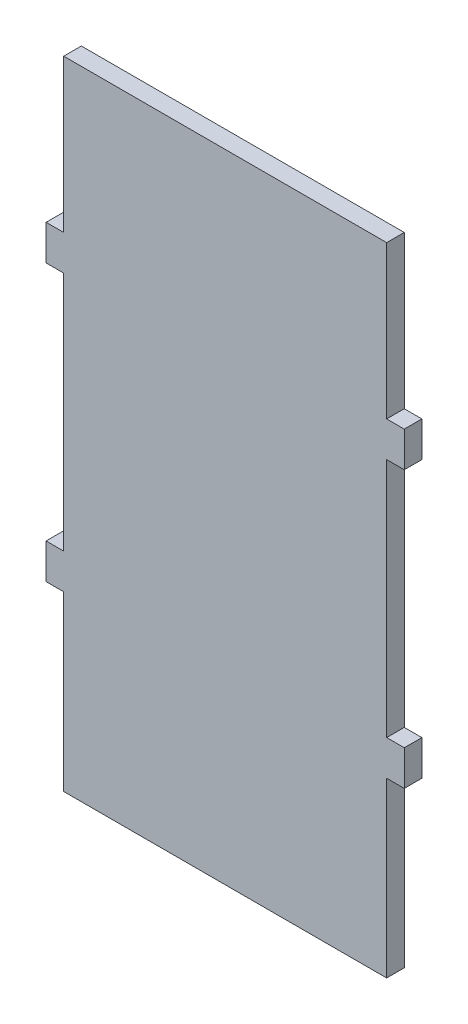
ISO-10303-21;
HEADER;
FILE_DESCRIPTION(('STEP AP214'),'2;1');
FILE_NAME('part.step','',(''),(''),'','','');
FILE_SCHEMA(('AUTOMOTIVE_DESIGN { 1 0 10303 214 1 1 1 1 }'));
ENDSEC;
DATA;
#1=APPLICATION_CONTEXT('core data for automotive mechanical design processes');
#2=APPLICATION_PROTOCOL_DEFINITION('international standard','automotive_design',2000,#1);
#3=PRODUCT_CONTEXT('',#1,'mechanical');
#4=PRODUCT('Part','Part','',(#3));
#5=PRODUCT_RELATED_PRODUCT_CATEGORY('part','',(#4));
#6=PRODUCT_DEFINITION_FORMATION('','',#4);
#7=PRODUCT_DEFINITION_CONTEXT('part definition',#1,'design');
#8=PRODUCT_DEFINITION('design','',#6,#7);
#9=PRODUCT_DEFINITION_SHAPE('','',#8);
#10=(LENGTH_UNIT() NAMED_UNIT(*) SI_UNIT(.MILLI.,.METRE.));
#11=(NAMED_UNIT(*) PLANE_ANGLE_UNIT() SI_UNIT($,.RADIAN.));
#12=(NAMED_UNIT(*) SI_UNIT($,.STERADIAN.) SOLID_ANGLE_UNIT());
#13=UNCERTAINTY_MEASURE_WITH_UNIT(LENGTH_MEASURE(1.E-05),#10,'distance_accuracy_value','');
#14=(GEOMETRIC_REPRESENTATION_CONTEXT(3) GLOBAL_UNCERTAINTY_ASSIGNED_CONTEXT((#13)) GLOBAL_UNIT_ASSIGNED_CONTEXT((#10,
#11,#12)) REPRESENTATION_CONTEXT('',''));
#15=CARTESIAN_POINT('',(0.,0.,0.));
#16=DIRECTION('',(0.,0.,1.));
#17=DIRECTION('',(1.,0.,0.));
#18=AXIS2_PLACEMENT_3D('',#15,#16,#17);
#19=CARTESIAN_POINT('',(0.,-26.,3.));
#20=DIRECTION('',(0.,-1.,0.));
#21=DIRECTION('',(1.,0.,0.));
#22=AXIS2_PLACEMENT_3D('',#19,#20,#21);
#23=PLANE('',#22);
#24=DIRECTION('',(-1.,0.,0.));
#25=VECTOR('',#24,1.);
#26=CARTESIAN_POINT('',(0.,-26.,0.));
#27=LINE('',#26,#25);
#28=CARTESIAN_POINT('',(0.,-26.,0.));
#29=VERTEX_POINT('',#28);
#30=CARTESIAN_POINT('',(-3.,-26.,0.));
#31=VERTEX_POINT('',#30);
#32=EDGE_CURVE('E207',#29,#31,#27,.T.);
#33=ORIENTED_EDGE('',*,*,#32,.T.);
#34=DIRECTION('',(0.,0.,-1.));
#35=VECTOR('',#34,1.);
#36=CARTESIAN_POINT('',(-3.,-26.,3.));
#37=LINE('',#36,#35);
#38=CARTESIAN_POINT('',(-3.,-26.,3.));
#39=VERTEX_POINT('',#38);
#40=EDGE_CURVE('E11',#39,#31,#37,.T.);
#41=ORIENTED_EDGE('',*,*,#40,.F.);
#42=DIRECTION('',(-1.,0.,0.));
#43=VECTOR('',#42,1.);
#44=CARTESIAN_POINT('',(0.,-26.,3.));
#45=LINE('',#44,#43);
#46=CARTESIAN_POINT('',(0.,-26.,3.));
#47=VERTEX_POINT('',#46);
#48=EDGE_CURVE('E245',#47,#39,#45,.T.);
#49=ORIENTED_EDGE('',*,*,#48,.F.);
#50=DIRECTION('',(0.,0.,-1.));
#51=VECTOR('',#50,1.);
#52=CARTESIAN_POINT('',(0.,-26.,3.));
#53=LINE('',#52,#51);
#54=EDGE_CURVE('E203',#47,#29,#53,.T.);
#55=ORIENTED_EDGE('',*,*,#54,.T.);
#56=EDGE_LOOP('',(#33,#41,#49,#55));
#57=FACE_BOUND('',#56,.T.);
#58=ADVANCED_FACE('F39',(#57),#23,.F.);
#59=CARTESIAN_POINT('',(-3.,-26.,3.));
#60=DIRECTION('',(1.,0.,0.));
#61=DIRECTION('',(0.,1.,0.));
#62=AXIS2_PLACEMENT_3D('',#59,#60,#61);
#63=PLANE('',#62);
#64=DIRECTION('',(0.,-1.,0.));
#65=VECTOR('',#64,1.);
#66=CARTESIAN_POINT('',(-3.,-26.,0.));
#67=LINE('',#66,#65);
#68=CARTESIAN_POINT('',(-3.,-32.,0.));
#69=VERTEX_POINT('',#68);
#70=EDGE_CURVE('E210',#31,#69,#67,.T.);
#71=ORIENTED_EDGE('',*,*,#70,.T.);
#72=DIRECTION('',(0.,0.,-1.));
#73=VECTOR('',#72,1.);
#74=CARTESIAN_POINT('',(-3.,-32.,3.));
#75=LINE('',#74,#73);
#76=CARTESIAN_POINT('',(-3.,-32.,3.));
#77=VERTEX_POINT('',#76);
#78=EDGE_CURVE('E47',#77,#69,#75,.T.);
#79=ORIENTED_EDGE('',*,*,#78,.F.);
#80=DIRECTION('',(0.,-1.,0.));
#81=VECTOR('',#80,1.);
#82=CARTESIAN_POINT('',(-3.,-26.,3.));
#83=LINE('',#82,#81);
#84=EDGE_CURVE('E134',#39,#77,#83,.T.);
#85=ORIENTED_EDGE('',*,*,#84,.F.);
#86=ORIENTED_EDGE('',*,*,#40,.T.);
#87=EDGE_LOOP('',(#71,#79,#85,#86));
#88=FACE_BOUND('',#87,.T.);
#89=ADVANCED_FACE('F363',(#88),#63,.F.);
#90=CARTESIAN_POINT('',(0.,-32.,3.));
#91=DIRECTION('',(0.,1.,0.));
#92=DIRECTION('',(0.,0.,1.));
#93=AXIS2_PLACEMENT_3D('',#90,#91,#92);
#94=PLANE('',#93);
#95=DIRECTION('',(1.,0.,0.));
#96=VECTOR('',#95,1.);
#97=CARTESIAN_POINT('',(0.,-32.,0.));
#98=LINE('',#97,#96);
#99=CARTESIAN_POINT('',(0.,-32.,0.));
#100=VERTEX_POINT('',#99);
#101=EDGE_CURVE('E212',#69,#100,#98,.T.);
#102=ORIENTED_EDGE('',*,*,#101,.T.);
#103=DIRECTION('',(0.,0.,-1.));
#104=VECTOR('',#103,1.);
#105=CARTESIAN_POINT('',(0.,-32.,3.));
#106=LINE('',#105,#104);
#107=CARTESIAN_POINT('',(0.,-32.,3.));
#108=VERTEX_POINT('',#107);
#109=EDGE_CURVE('E288',#108,#100,#106,.T.);
#110=ORIENTED_EDGE('',*,*,#109,.F.);
#111=DIRECTION('',(1.,0.,0.));
#112=VECTOR('',#111,1.);
#113=CARTESIAN_POINT('',(0.,-32.,3.));
#114=LINE('',#113,#112);
#115=EDGE_CURVE('E296',#77,#108,#114,.T.);
#116=ORIENTED_EDGE('',*,*,#115,.F.);
#117=ORIENTED_EDGE('',*,*,#78,.T.);
#118=EDGE_LOOP('',(#102,#110,#116,#117));
#119=FACE_BOUND('',#118,.T.);
#120=ADVANCED_FACE('F294',(#119),#94,.F.);
#121=CARTESIAN_POINT('',(0.,-32.,3.));
#122=DIRECTION('',(1.,0.,0.));
#123=DIRECTION('',(0.,1.,0.));
#124=AXIS2_PLACEMENT_3D('',#121,#122,#123);
#125=PLANE('',#124);
#126=DIRECTION('',(0.,-1.,0.));
#127=VECTOR('',#126,1.);
#128=CARTESIAN_POINT('',(0.,-32.,0.));
#129=LINE('',#128,#127);
#130=CARTESIAN_POINT('',(0.,-73.,0.));
#131=VERTEX_POINT('',#130);
#132=EDGE_CURVE('E214',#100,#131,#129,.T.);
#133=ORIENTED_EDGE('',*,*,#132,.T.);
#134=DIRECTION('',(0.,0.,-1.));
#135=VECTOR('',#134,1.);
#136=CARTESIAN_POINT('',(0.,-73.,3.));
#137=LINE('',#136,#135);
#138=CARTESIAN_POINT('',(0.,-73.,3.));
#139=VERTEX_POINT('',#138);
#140=EDGE_CURVE('E285',#139,#131,#137,.T.);
#141=ORIENTED_EDGE('',*,*,#140,.F.);
#142=DIRECTION('',(0.,-1.,0.));
#143=VECTOR('',#142,1.);
#144=CARTESIAN_POINT('',(0.,-32.,3.));
#145=LINE('',#144,#143);
#146=EDGE_CURVE('E314',#108,#139,#145,.T.);
#147=ORIENTED_EDGE('',*,*,#146,.F.);
#148=ORIENTED_EDGE('',*,*,#109,.T.);
#149=EDGE_LOOP('',(#133,#141,#147,#148));
#150=FACE_BOUND('',#149,.T.);
#151=ADVANCED_FACE('F305',(#150),#125,.F.);
#152=CARTESIAN_POINT('',(0.,-73.,3.));
#153=DIRECTION('',(0.,-1.,0.));
#154=DIRECTION('',(0.,0.,-1.));
#155=AXIS2_PLACEMENT_3D('',#152,#153,#154);
#156=PLANE('',#155);
#157=DIRECTION('',(-1.,0.,0.));
#158=VECTOR('',#157,1.);
#159=CARTESIAN_POINT('',(0.,-73.,0.));
#160=LINE('',#159,#158);
#161=CARTESIAN_POINT('',(-3.,-73.,0.));
#162=VERTEX_POINT('',#161);
#163=EDGE_CURVE('E216',#131,#162,#160,.T.);
#164=ORIENTED_EDGE('',*,*,#163,.T.);
#165=DIRECTION('',(0.,0.,-1.));
#166=VECTOR('',#165,1.);
#167=CARTESIAN_POINT('',(-3.,-73.,3.));
#168=LINE('',#167,#166);
#169=CARTESIAN_POINT('',(-3.,-73.,3.));
#170=VERTEX_POINT('',#169);
#171=EDGE_CURVE('E282',#170,#162,#168,.T.);
#172=ORIENTED_EDGE('',*,*,#171,.F.);
#173=DIRECTION('',(-1.,0.,0.));
#174=VECTOR('',#173,1.);
#175=CARTESIAN_POINT('',(0.,-73.,3.));
#176=LINE('',#175,#174);
#177=EDGE_CURVE('E311',#139,#170,#176,.T.);
#178=ORIENTED_EDGE('',*,*,#177,.F.);
#179=ORIENTED_EDGE('',*,*,#140,.T.);
#180=EDGE_LOOP('',(#164,#172,#178,#179));
#181=FACE_BOUND('',#180,.T.);
#182=ADVANCED_FACE('F309',(#181),#156,.F.);
#183=CARTESIAN_POINT('',(-3.,-73.,3.));
#184=DIRECTION('',(1.,0.,0.));
#185=DIRECTION('',(0.,1.,0.));
#186=AXIS2_PLACEMENT_3D('',#183,#184,#185);
#187=PLANE('',#186);
#188=DIRECTION('',(0.,-1.,0.));
#189=VECTOR('',#188,1.);
#190=CARTESIAN_POINT('',(-3.,-73.,0.));
#191=LINE('',#190,#189);
#192=CARTESIAN_POINT('',(-3.,-79.,0.));
#193=VERTEX_POINT('',#192);
#194=EDGE_CURVE('E218',#162,#193,#191,.T.);
#195=ORIENTED_EDGE('',*,*,#194,.T.);
#196=DIRECTION('',(0.,0.,-1.));
#197=VECTOR('',#196,1.);
#198=CARTESIAN_POINT('',(-3.,-79.,3.));
#199=LINE('',#198,#197);
#200=CARTESIAN_POINT('',(-3.,-79.,3.));
#201=VERTEX_POINT('',#200);
#202=EDGE_CURVE('E279',#201,#193,#199,.T.);
#203=ORIENTED_EDGE('',*,*,#202,.F.);
#204=DIRECTION('',(0.,-1.,0.));
#205=VECTOR('',#204,1.);
#206=CARTESIAN_POINT('',(-3.,-73.,3.));
#207=LINE('',#206,#205);
#208=EDGE_CURVE('E313',#170,#201,#207,.T.);
#209=ORIENTED_EDGE('',*,*,#208,.F.);
#210=ORIENTED_EDGE('',*,*,#171,.T.);
#211=EDGE_LOOP('',(#195,#203,#209,#210));
#212=FACE_BOUND('',#211,.T.);
#213=ADVANCED_FACE('F376',(#212),#187,.F.);
#214=CARTESIAN_POINT('',(0.,-79.,3.));
#215=DIRECTION('',(0.,1.,0.));
#216=DIRECTION('',(0.,0.,1.));
#217=AXIS2_PLACEMENT_3D('',#214,#215,#216);
#218=PLANE('',#217);
#219=DIRECTION('',(1.,0.,0.));
#220=VECTOR('',#219,1.);
#221=CARTESIAN_POINT('',(0.,-79.,0.));
#222=LINE('',#221,#220);
#223=CARTESIAN_POINT('',(0.,-79.,0.));
#224=VERTEX_POINT('',#223);
#225=EDGE_CURVE('E220',#193,#224,#222,.T.);
#226=ORIENTED_EDGE('',*,*,#225,.T.);
#227=DIRECTION('',(0.,0.,-1.));
#228=VECTOR('',#227,1.);
#229=CARTESIAN_POINT('',(0.,-79.,3.));
#230=LINE('',#229,#228);
#231=CARTESIAN_POINT('',(0.,-79.,3.));
#232=VERTEX_POINT('',#231);
#233=EDGE_CURVE('E276',#232,#224,#230,.T.);
#234=ORIENTED_EDGE('',*,*,#233,.F.);
#235=DIRECTION('',(1.,0.,0.));
#236=VECTOR('',#235,1.);
#237=CARTESIAN_POINT('',(0.,-79.,3.));
#238=LINE('',#237,#236);
#239=EDGE_CURVE('E316',#201,#232,#238,.T.);
#240=ORIENTED_EDGE('',*,*,#239,.F.);
#241=ORIENTED_EDGE('',*,*,#202,.T.);
#242=EDGE_LOOP('',(#226,#234,#240,#241));
#243=FACE_BOUND('',#242,.T.);
#244=ADVANCED_FACE('F379',(#243),#218,.F.);
#245=CARTESIAN_POINT('',(0.,-79.,3.));
#246=DIRECTION('',(1.,0.,0.));
#247=DIRECTION('',(0.,1.,0.));
#248=AXIS2_PLACEMENT_3D('',#245,#246,#247);
#249=PLANE('',#248);
#250=DIRECTION('',(0.,-1.,0.));
#251=VECTOR('',#250,1.);
#252=CARTESIAN_POINT('',(0.,-79.,0.));
#253=LINE('',#252,#251);
#254=CARTESIAN_POINT('',(0.,-108.46,0.));
#255=VERTEX_POINT('',#254);
#256=EDGE_CURVE('E222',#224,#255,#253,.T.);
#257=ORIENTED_EDGE('',*,*,#256,.T.);
#258=DIRECTION('',(0.,0.,-1.));
#259=VECTOR('',#258,1.);
#260=CARTESIAN_POINT('',(0.,-108.46,3.));
#261=LINE('',#260,#259);
#262=CARTESIAN_POINT('',(0.,-108.46,3.));
#263=VERTEX_POINT('',#262);
#264=EDGE_CURVE('E273',#263,#255,#261,.T.);
#265=ORIENTED_EDGE('',*,*,#264,.F.);
#266=DIRECTION('',(0.,-1.,0.));
#267=VECTOR('',#266,1.);
#268=CARTESIAN_POINT('',(0.,-79.,3.));
#269=LINE('',#268,#267);
#270=EDGE_CURVE('E322',#232,#263,#269,.T.);
#271=ORIENTED_EDGE('',*,*,#270,.F.);
#272=ORIENTED_EDGE('',*,*,#233,.T.);
#273=EDGE_LOOP('',(#257,#265,#271,#272));
#274=FACE_BOUND('',#273,.T.);
#275=ADVANCED_FACE('F383',(#274),#249,.F.);
#276=CARTESIAN_POINT('',(0.,-108.46,3.));
#277=DIRECTION('',(0.,1.,0.));
#278=DIRECTION('',(0.,0.,1.));
#279=AXIS2_PLACEMENT_3D('',#276,#277,#278);
#280=PLANE('',#279);
#281=DIRECTION('',(1.,0.,0.));
#282=VECTOR('',#281,1.);
#283=CARTESIAN_POINT('',(0.,-108.46,0.));
#284=LINE('',#283,#282);
#285=CARTESIAN_POINT('',(55.,-108.46,0.));
#286=VERTEX_POINT('',#285);
#287=EDGE_CURVE('E224',#255,#286,#284,.T.);
#288=ORIENTED_EDGE('',*,*,#287,.T.);
#289=DIRECTION('',(0.,0.,-1.));
#290=VECTOR('',#289,1.);
#291=CARTESIAN_POINT('',(55.,-108.46,3.));
#292=LINE('',#291,#290);
#293=CARTESIAN_POINT('',(55.,-108.46,3.));
#294=VERTEX_POINT('',#293);
#295=EDGE_CURVE('E270',#294,#286,#292,.T.);
#296=ORIENTED_EDGE('',*,*,#295,.F.);
#297=DIRECTION('',(1.,0.,0.));
#298=VECTOR('',#297,1.);
#299=CARTESIAN_POINT('',(0.,-108.46,3.));
#300=LINE('',#299,#298);
#301=EDGE_CURVE('E324',#263,#294,#300,.T.);
#302=ORIENTED_EDGE('',*,*,#301,.F.);
#303=ORIENTED_EDGE('',*,*,#264,.T.);
#304=EDGE_LOOP('',(#288,#296,#302,#303));
#305=FACE_BOUND('',#304,.T.);
#306=ADVANCED_FACE('F387',(#305),#280,.F.);
#307=CARTESIAN_POINT('',(55.,-79.,3.));
#308=DIRECTION('',(-1.,0.,0.));
#309=DIRECTION('',(0.,-1.,0.));
#310=AXIS2_PLACEMENT_3D('',#307,#308,#309);
#311=PLANE('',#310);
#312=DIRECTION('',(0.,1.,0.));
#313=VECTOR('',#312,1.);
#314=CARTESIAN_POINT('',(55.,-79.,0.));
#315=LINE('',#314,#313);
#316=CARTESIAN_POINT('',(55.,-79.,0.));
#317=VERTEX_POINT('',#316);
#318=EDGE_CURVE('E226',#286,#317,#315,.T.);
#319=ORIENTED_EDGE('',*,*,#318,.T.);
#320=DIRECTION('',(0.,0.,-1.));
#321=VECTOR('',#320,1.);
#322=CARTESIAN_POINT('',(55.,-79.,3.));
#323=LINE('',#322,#321);
#324=CARTESIAN_POINT('',(55.,-79.,3.));
#325=VERTEX_POINT('',#324);
#326=EDGE_CURVE('E267',#325,#317,#323,.T.);
#327=ORIENTED_EDGE('',*,*,#326,.F.);
#328=DIRECTION('',(0.,1.,0.));
#329=VECTOR('',#328,1.);
#330=CARTESIAN_POINT('',(55.,-79.,3.));
#331=LINE('',#330,#329);
#332=EDGE_CURVE('E326',#294,#325,#331,.T.);
#333=ORIENTED_EDGE('',*,*,#332,.F.);
#334=ORIENTED_EDGE('',*,*,#295,.T.);
#335=EDGE_LOOP('',(#319,#327,#333,#334));
#336=FACE_BOUND('',#335,.T.);
#337=ADVANCED_FACE('F391',(#336),#311,.F.);
#338=CARTESIAN_POINT('',(55.,-79.,3.));
#339=DIRECTION('',(0.,1.,0.));
#340=DIRECTION('',(0.,0.,1.));
#341=AXIS2_PLACEMENT_3D('',#338,#339,#340);
#342=PLANE('',#341);
#343=DIRECTION('',(1.,0.,0.));
#344=VECTOR('',#343,1.);
#345=CARTESIAN_POINT('',(55.,-79.,0.));
#346=LINE('',#345,#344);
#347=CARTESIAN_POINT('',(58.,-79.,0.));
#348=VERTEX_POINT('',#347);
#349=EDGE_CURVE('E228',#317,#348,#346,.T.);
#350=ORIENTED_EDGE('',*,*,#349,.T.);
#351=DIRECTION('',(0.,0.,-1.));
#352=VECTOR('',#351,1.);
#353=CARTESIAN_POINT('',(58.,-79.,3.));
#354=LINE('',#353,#352);
#355=CARTESIAN_POINT('',(58.,-79.,3.));
#356=VERTEX_POINT('',#355);
#357=EDGE_CURVE('E264',#356,#348,#354,.T.);
#358=ORIENTED_EDGE('',*,*,#357,.F.);
#359=DIRECTION('',(1.,0.,0.));
#360=VECTOR('',#359,1.);
#361=CARTESIAN_POINT('',(55.,-79.,3.));
#362=LINE('',#361,#360);
#363=EDGE_CURVE('E328',#325,#356,#362,.T.);
#364=ORIENTED_EDGE('',*,*,#363,.F.);
#365=ORIENTED_EDGE('',*,*,#326,.T.);
#366=EDGE_LOOP('',(#350,#358,#364,#365));
#367=FACE_BOUND('',#366,.T.);
#368=ADVANCED_FACE('F395',(#367),#342,.F.);
#369=CARTESIAN_POINT('',(58.,-73.,3.));
#370=DIRECTION('',(-1.,0.,0.));
#371=DIRECTION('',(0.,-1.,0.));
#372=AXIS2_PLACEMENT_3D('',#369,#370,#371);
#373=PLANE('',#372);
#374=DIRECTION('',(0.,1.,0.));
#375=VECTOR('',#374,1.);
#376=CARTESIAN_POINT('',(58.,-73.,0.));
#377=LINE('',#376,#375);
#378=CARTESIAN_POINT('',(58.,-73.,0.));
#379=VERTEX_POINT('',#378);
#380=EDGE_CURVE('E230',#348,#379,#377,.T.);
#381=ORIENTED_EDGE('',*,*,#380,.T.);
#382=DIRECTION('',(0.,0.,-1.));
#383=VECTOR('',#382,1.);
#384=CARTESIAN_POINT('',(58.,-73.,3.));
#385=LINE('',#384,#383);
#386=CARTESIAN_POINT('',(58.,-73.,3.));
#387=VERTEX_POINT('',#386);
#388=EDGE_CURVE('E261',#387,#379,#385,.T.);
#389=ORIENTED_EDGE('',*,*,#388,.F.);
#390=DIRECTION('',(0.,1.,0.));
#391=VECTOR('',#390,1.);
#392=CARTESIAN_POINT('',(58.,-73.,3.));
#393=LINE('',#392,#391);
#394=EDGE_CURVE('E330',#356,#387,#393,.T.);
#395=ORIENTED_EDGE('',*,*,#394,.F.);
#396=ORIENTED_EDGE('',*,*,#357,.T.);
#397=EDGE_LOOP('',(#381,#389,#395,#396));
#398=FACE_BOUND('',#397,.T.);
#399=ADVANCED_FACE('F399',(#398),#373,.F.);
#400=CARTESIAN_POINT('',(55.,-73.,3.));
#401=DIRECTION('',(0.,-1.,0.));
#402=DIRECTION('',(1.,0.,0.));
#403=AXIS2_PLACEMENT_3D('',#400,#401,#402);
#404=PLANE('',#403);
#405=DIRECTION('',(-1.,0.,0.));
#406=VECTOR('',#405,1.);
#407=CARTESIAN_POINT('',(55.,-73.,0.));
#408=LINE('',#407,#406);
#409=CARTESIAN_POINT('',(55.,-73.,0.));
#410=VERTEX_POINT('',#409);
#411=EDGE_CURVE('E232',#379,#410,#408,.T.);
#412=ORIENTED_EDGE('',*,*,#411,.T.);
#413=DIRECTION('',(0.,0.,-1.));
#414=VECTOR('',#413,1.);
#415=CARTESIAN_POINT('',(55.,-73.,3.));
#416=LINE('',#415,#414);
#417=CARTESIAN_POINT('',(55.,-73.,3.));
#418=VERTEX_POINT('',#417);
#419=EDGE_CURVE('E258',#418,#410,#416,.T.);
#420=ORIENTED_EDGE('',*,*,#419,.F.);
#421=DIRECTION('',(-1.,0.,0.));
#422=VECTOR('',#421,1.);
#423=CARTESIAN_POINT('',(55.,-73.,3.));
#424=LINE('',#423,#422);
#425=EDGE_CURVE('E332',#387,#418,#424,.T.);
#426=ORIENTED_EDGE('',*,*,#425,.F.);
#427=ORIENTED_EDGE('',*,*,#388,.T.);
#428=EDGE_LOOP('',(#412,#420,#426,#427));
#429=FACE_BOUND('',#428,.T.);
#430=ADVANCED_FACE('F403',(#429),#404,.F.);
#431=CARTESIAN_POINT('',(55.,-32.,3.));
#432=DIRECTION('',(-1.,0.,0.));
#433=DIRECTION('',(0.,-1.,0.));
#434=AXIS2_PLACEMENT_3D('',#431,#432,#433);
#435=PLANE('',#434);
#436=DIRECTION('',(0.,1.,0.));
#437=VECTOR('',#436,1.);
#438=CARTESIAN_POINT('',(55.,-32.,0.));
#439=LINE('',#438,#437);
#440=CARTESIAN_POINT('',(55.,-32.,0.));
#441=VERTEX_POINT('',#440);
#442=EDGE_CURVE('E234',#410,#441,#439,.T.);
#443=ORIENTED_EDGE('',*,*,#442,.T.);
#444=DIRECTION('',(0.,0.,-1.));
#445=VECTOR('',#444,1.);
#446=CARTESIAN_POINT('',(55.,-32.,3.));
#447=LINE('',#446,#445);
#448=CARTESIAN_POINT('',(55.,-32.,3.));
#449=VERTEX_POINT('',#448);
#450=EDGE_CURVE('E255',#449,#441,#447,.T.);
#451=ORIENTED_EDGE('',*,*,#450,.F.);
#452=DIRECTION('',(0.,1.,0.));
#453=VECTOR('',#452,1.);
#454=CARTESIAN_POINT('',(55.,-32.,3.));
#455=LINE('',#454,#453);
#456=EDGE_CURVE('E334',#418,#449,#455,.T.);
#457=ORIENTED_EDGE('',*,*,#456,.F.);
#458=ORIENTED_EDGE('',*,*,#419,.T.);
#459=EDGE_LOOP('',(#443,#451,#457,#458));
#460=FACE_BOUND('',#459,.T.);
#461=ADVANCED_FACE('F407',(#460),#435,.F.);
#462=CARTESIAN_POINT('',(55.,-32.,3.));
#463=DIRECTION('',(0.,1.,0.));
#464=DIRECTION('',(-1.,0.,0.));
#465=AXIS2_PLACEMENT_3D('',#462,#463,#464);
#466=PLANE('',#465);
#467=DIRECTION('',(1.,0.,0.));
#468=VECTOR('',#467,1.);
#469=CARTESIAN_POINT('',(55.,-32.,0.));
#470=LINE('',#469,#468);
#471=CARTESIAN_POINT('',(58.,-32.,0.));
#472=VERTEX_POINT('',#471);
#473=EDGE_CURVE('E236',#441,#472,#470,.T.);
#474=ORIENTED_EDGE('',*,*,#473,.T.);
#475=DIRECTION('',(0.,0.,-1.));
#476=VECTOR('',#475,1.);
#477=CARTESIAN_POINT('',(58.,-32.,3.));
#478=LINE('',#477,#476);
#479=CARTESIAN_POINT('',(58.,-32.,3.));
#480=VERTEX_POINT('',#479);
#481=EDGE_CURVE('E252',#480,#472,#478,.T.);
#482=ORIENTED_EDGE('',*,*,#481,.F.);
#483=DIRECTION('',(1.,0.,0.));
#484=VECTOR('',#483,1.);
#485=CARTESIAN_POINT('',(55.,-32.,3.));
#486=LINE('',#485,#484);
#487=EDGE_CURVE('E336',#449,#480,#486,.T.);
#488=ORIENTED_EDGE('',*,*,#487,.F.);
#489=ORIENTED_EDGE('',*,*,#450,.T.);
#490=EDGE_LOOP('',(#474,#482,#488,#489));
#491=FACE_BOUND('',#490,.T.);
#492=ADVANCED_FACE('F411',(#491),#466,.F.);
#493=CARTESIAN_POINT('',(58.,-26.,3.));
#494=DIRECTION('',(-1.,0.,0.));
#495=DIRECTION('',(0.,-1.,0.));
#496=AXIS2_PLACEMENT_3D('',#493,#494,#495);
#497=PLANE('',#496);
#498=DIRECTION('',(0.,1.,0.));
#499=VECTOR('',#498,1.);
#500=CARTESIAN_POINT('',(58.,-26.,0.));
#501=LINE('',#500,#499);
#502=CARTESIAN_POINT('',(58.,-26.,0.));
#503=VERTEX_POINT('',#502);
#504=EDGE_CURVE('E238',#472,#503,#501,.T.);
#505=ORIENTED_EDGE('',*,*,#504,.T.);
#506=DIRECTION('',(0.,0.,-1.));
#507=VECTOR('',#506,1.);
#508=CARTESIAN_POINT('',(58.,-26.,3.));
#509=LINE('',#508,#507);
#510=CARTESIAN_POINT('',(58.,-26.,3.));
#511=VERTEX_POINT('',#510);
#512=EDGE_CURVE('E249',#511,#503,#509,.T.);
#513=ORIENTED_EDGE('',*,*,#512,.F.);
#514=DIRECTION('',(0.,1.,0.));
#515=VECTOR('',#514,1.);
#516=CARTESIAN_POINT('',(58.,-26.,3.));
#517=LINE('',#516,#515);
#518=EDGE_CURVE('E338',#480,#511,#517,.T.);
#519=ORIENTED_EDGE('',*,*,#518,.F.);
#520=ORIENTED_EDGE('',*,*,#481,.T.);
#521=EDGE_LOOP('',(#505,#513,#519,#520));
#522=FACE_BOUND('',#521,.T.);
#523=ADVANCED_FACE('F344',(#522),#497,.F.);
#524=CARTESIAN_POINT('',(55.,-26.,3.));
#525=DIRECTION('',(0.,-1.,0.));
#526=DIRECTION('',(1.,0.,0.));
#527=AXIS2_PLACEMENT_3D('',#524,#525,#526);
#528=PLANE('',#527);
#529=DIRECTION('',(-1.,0.,0.));
#530=VECTOR('',#529,1.);
#531=CARTESIAN_POINT('',(55.,-26.,0.));
#532=LINE('',#531,#530);
#533=CARTESIAN_POINT('',(55.,-26.,0.));
#534=VERTEX_POINT('',#533);
#535=EDGE_CURVE('E240',#503,#534,#532,.T.);
#536=ORIENTED_EDGE('',*,*,#535,.T.);
#537=DIRECTION('',(0.,0.,-1.));
#538=VECTOR('',#537,1.);
#539=CARTESIAN_POINT('',(55.,-26.,3.));
#540=LINE('',#539,#538);
#541=CARTESIAN_POINT('',(55.,-26.,3.));
#542=VERTEX_POINT('',#541);
#543=EDGE_CURVE('E198',#542,#534,#540,.T.);
#544=ORIENTED_EDGE('',*,*,#543,.F.);
#545=DIRECTION('',(-1.,0.,0.));
#546=VECTOR('',#545,1.);
#547=CARTESIAN_POINT('',(55.,-26.,3.));
#548=LINE('',#547,#546);
#549=EDGE_CURVE('E189',#511,#542,#548,.T.);
#550=ORIENTED_EDGE('',*,*,#549,.F.);
#551=ORIENTED_EDGE('',*,*,#512,.T.);
#552=EDGE_LOOP('',(#536,#544,#550,#551));
#553=FACE_BOUND('',#552,.T.);
#554=ADVANCED_FACE('F348',(#553),#528,.F.);
#555=CARTESIAN_POINT('',(55.,0.,3.));
#556=DIRECTION('',(-1.,0.,0.));
#557=DIRECTION('',(0.,-1.,0.));
#558=AXIS2_PLACEMENT_3D('',#555,#556,#557);
#559=PLANE('',#558);
#560=DIRECTION('',(0.,1.,0.));
#561=VECTOR('',#560,1.);
#562=CARTESIAN_POINT('',(55.,0.,0.));
#563=LINE('',#562,#561);
#564=CARTESIAN_POINT('',(55.,0.,0.));
#565=VERTEX_POINT('',#564);
#566=EDGE_CURVE('E197',#534,#565,#563,.T.);
#567=ORIENTED_EDGE('',*,*,#566,.T.);
#568=DIRECTION('',(0.,0.,-1.));
#569=VECTOR('',#568,1.);
#570=CARTESIAN_POINT('',(55.,0.,3.));
#571=LINE('',#570,#569);
#572=CARTESIAN_POINT('',(55.,0.,3.));
#573=VERTEX_POINT('',#572);
#574=EDGE_CURVE('E194',#573,#565,#571,.T.);
#575=ORIENTED_EDGE('',*,*,#574,.F.);
#576=DIRECTION('',(0.,1.,0.));
#577=VECTOR('',#576,1.);
#578=CARTESIAN_POINT('',(55.,0.,3.));
#579=LINE('',#578,#577);
#580=EDGE_CURVE('E183',#542,#573,#579,.T.);
#581=ORIENTED_EDGE('',*,*,#580,.F.);
#582=ORIENTED_EDGE('',*,*,#543,.T.);
#583=EDGE_LOOP('',(#567,#575,#581,#582));
#584=FACE_BOUND('',#583,.T.);
#585=ADVANCED_FACE('F195',(#584),#559,.F.);
#586=CARTESIAN_POINT('',(0.,0.,3.));
#587=DIRECTION('',(0.,-1.,0.));
#588=DIRECTION('',(0.,0.,-1.));
#589=AXIS2_PLACEMENT_3D('',#586,#587,#588);
#590=PLANE('',#589);
#591=DIRECTION('',(-1.,0.,0.));
#592=VECTOR('',#591,1.);
#593=CARTESIAN_POINT('',(0.,0.,0.));
#594=LINE('',#593,#592);
#595=CARTESIAN_POINT('',(0.,0.,0.));
#596=VERTEX_POINT('',#595);
#597=EDGE_CURVE('E120',#565,#596,#594,.T.);
#598=ORIENTED_EDGE('',*,*,#597,.T.);
#599=DIRECTION('',(0.,0.,-1.));
#600=VECTOR('',#599,1.);
#601=CARTESIAN_POINT('',(0.,0.,3.));
#602=LINE('',#601,#600);
#603=CARTESIAN_POINT('',(0.,0.,3.));
#604=VERTEX_POINT('',#603);
#605=EDGE_CURVE('E199',#604,#596,#602,.T.);
#606=ORIENTED_EDGE('',*,*,#605,.F.);
#607=DIRECTION('',(-1.,0.,0.));
#608=VECTOR('',#607,1.);
#609=CARTESIAN_POINT('',(0.,0.,3.));
#610=LINE('',#609,#608);
#611=EDGE_CURVE('E187',#573,#604,#610,.T.);
#612=ORIENTED_EDGE('',*,*,#611,.F.);
#613=ORIENTED_EDGE('',*,*,#574,.T.);
#614=EDGE_LOOP('',(#598,#606,#612,#613));
#615=FACE_BOUND('',#614,.T.);
#616=ADVANCED_FACE('F201',(#615),#590,.F.);
#617=CARTESIAN_POINT('',(0.,0.,3.));
#618=DIRECTION('',(1.,0.,0.));
#619=DIRECTION('',(0.,1.,0.));
#620=AXIS2_PLACEMENT_3D('',#617,#618,#619);
#621=PLANE('',#620);
#622=DIRECTION('',(0.,-1.,0.));
#623=VECTOR('',#622,1.);
#624=CARTESIAN_POINT('',(0.,0.,0.));
#625=LINE('',#624,#623);
#626=EDGE_CURVE('E126',#596,#29,#625,.T.);
#627=ORIENTED_EDGE('',*,*,#626,.T.);
#628=ORIENTED_EDGE('',*,*,#54,.F.);
#629=DIRECTION('',(0.,-1.,0.));
#630=VECTOR('',#629,1.);
#631=CARTESIAN_POINT('',(0.,0.,3.));
#632=LINE('',#631,#630);
#633=EDGE_CURVE('E55',#604,#47,#632,.T.);
#634=ORIENTED_EDGE('',*,*,#633,.F.);
#635=ORIENTED_EDGE('',*,*,#605,.T.);
#636=EDGE_LOOP('',(#627,#628,#634,#635));
#637=FACE_BOUND('',#636,.T.);
#638=ADVANCED_FACE('F352',(#637),#621,.F.);
#639=CARTESIAN_POINT('',(0.,0.,3.));
#640=DIRECTION('',(0.,0.,1.));
#641=DIRECTION('',(1.,0.,0.));
#642=AXIS2_PLACEMENT_3D('',#639,#640,#641);
#643=PLANE('',#642);
#644=ORIENTED_EDGE('',*,*,#48,.T.);
#645=ORIENTED_EDGE('',*,*,#84,.T.);
#646=ORIENTED_EDGE('',*,*,#115,.T.);
#647=ORIENTED_EDGE('',*,*,#146,.T.);
#648=ORIENTED_EDGE('',*,*,#177,.T.);
#649=ORIENTED_EDGE('',*,*,#208,.T.);
#650=ORIENTED_EDGE('',*,*,#239,.T.);
#651=ORIENTED_EDGE('',*,*,#270,.T.);
#652=ORIENTED_EDGE('',*,*,#301,.T.);
#653=ORIENTED_EDGE('',*,*,#332,.T.);
#654=ORIENTED_EDGE('',*,*,#363,.T.);
#655=ORIENTED_EDGE('',*,*,#394,.T.);
#656=ORIENTED_EDGE('',*,*,#425,.T.);
#657=ORIENTED_EDGE('',*,*,#456,.T.);
#658=ORIENTED_EDGE('',*,*,#487,.T.);
#659=ORIENTED_EDGE('',*,*,#518,.T.);
#660=ORIENTED_EDGE('',*,*,#549,.T.);
#661=ORIENTED_EDGE('',*,*,#580,.T.);
#662=ORIENTED_EDGE('',*,*,#611,.T.);
#663=ORIENTED_EDGE('',*,*,#633,.T.);
#664=EDGE_LOOP('',(#644,#645,#646,#647,#648,#649,#650,#651,#652,#653,#654,#655,#656,#657,#658,
#659,#660,#661,#662,#663));
#665=FACE_BOUND('',#664,.T.);
#666=ADVANCED_FACE('F185',(#665),#643,.T.);
#667=CARTESIAN_POINT('',(0.,0.,0.));
#668=DIRECTION('',(0.,0.,1.));
#669=DIRECTION('',(1.,0.,0.));
#670=AXIS2_PLACEMENT_3D('',#667,#668,#669);
#671=PLANE('',#670);
#672=ORIENTED_EDGE('',*,*,#32,.F.);
#673=ORIENTED_EDGE('',*,*,#626,.F.);
#674=ORIENTED_EDGE('',*,*,#597,.F.);
#675=ORIENTED_EDGE('',*,*,#566,.F.);
#676=ORIENTED_EDGE('',*,*,#535,.F.);
#677=ORIENTED_EDGE('',*,*,#504,.F.);
#678=ORIENTED_EDGE('',*,*,#473,.F.);
#679=ORIENTED_EDGE('',*,*,#442,.F.);
#680=ORIENTED_EDGE('',*,*,#411,.F.);
#681=ORIENTED_EDGE('',*,*,#380,.F.);
#682=ORIENTED_EDGE('',*,*,#349,.F.);
#683=ORIENTED_EDGE('',*,*,#318,.F.);
#684=ORIENTED_EDGE('',*,*,#287,.F.);
#685=ORIENTED_EDGE('',*,*,#256,.F.);
#686=ORIENTED_EDGE('',*,*,#225,.F.);
#687=ORIENTED_EDGE('',*,*,#194,.F.);
#688=ORIENTED_EDGE('',*,*,#163,.F.);
#689=ORIENTED_EDGE('',*,*,#132,.F.);
#690=ORIENTED_EDGE('',*,*,#101,.F.);
#691=ORIENTED_EDGE('',*,*,#70,.F.);
#692=EDGE_LOOP('',(#672,#673,#674,#675,#676,#677,#678,#679,#680,#681,#682,#683,#684,#685,#686,
#687,#688,#689,#690,#691));
#693=FACE_BOUND('',#692,.T.);
#694=ADVANCED_FACE('F300',(#693),#671,.F.);
#695=CLOSED_SHELL('',(#58,#89,#120,#151,#182,#213,#244,#275,#306,#337,#368,#399,#430,#461,#492,
#523,#554,#585,#616,#638,#666,#694));
#696=MANIFOLD_SOLID_BREP('B2',#695);
#697=ADVANCED_BREP_SHAPE_REPRESENTATION('',(#18,#696),#14);
#698=SHAPE_DEFINITION_REPRESENTATION(#9,#697);
ENDSEC;
END-ISO-10303-21;
